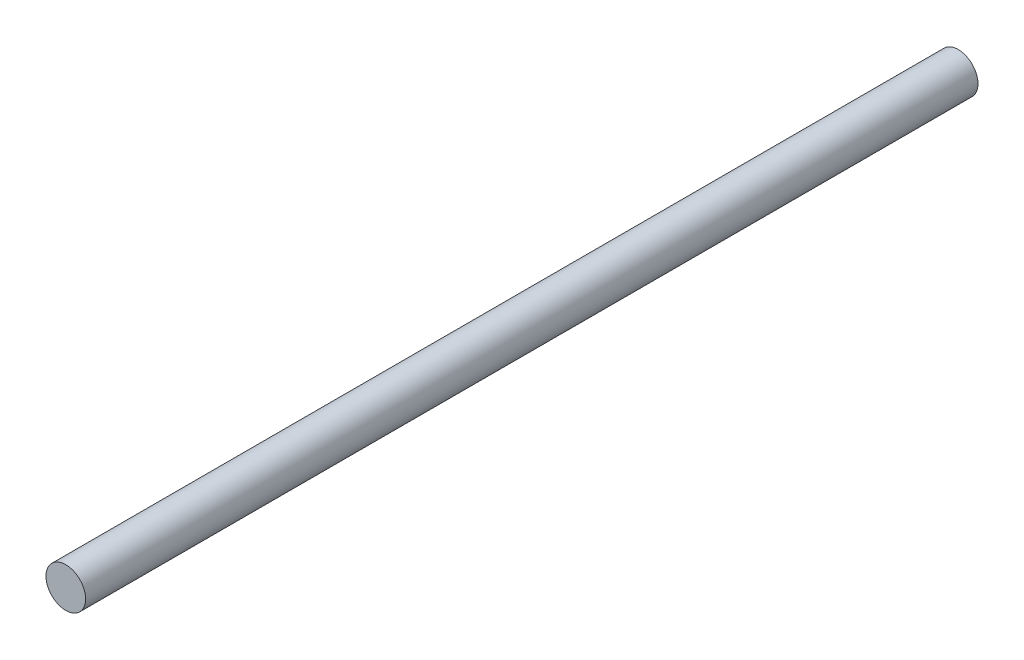
ISO-10303-21;
HEADER;
FILE_DESCRIPTION(('STEP AP214'),'2;1');
FILE_NAME('part.step','',(''),(''),'','','');
FILE_SCHEMA(('AUTOMOTIVE_DESIGN { 1 0 10303 214 1 1 1 1 }'));
ENDSEC;
DATA;
#1=APPLICATION_CONTEXT('core data for automotive mechanical design processes');
#2=APPLICATION_PROTOCOL_DEFINITION('international standard','automotive_design',2000,#1);
#3=PRODUCT_CONTEXT('',#1,'mechanical');
#4=PRODUCT('Part','Part','',(#3));
#5=PRODUCT_RELATED_PRODUCT_CATEGORY('part','',(#4));
#6=PRODUCT_DEFINITION_FORMATION('','',#4);
#7=PRODUCT_DEFINITION_CONTEXT('part definition',#1,'design');
#8=PRODUCT_DEFINITION('design','',#6,#7);
#9=PRODUCT_DEFINITION_SHAPE('','',#8);
#10=(LENGTH_UNIT() NAMED_UNIT(*) SI_UNIT(.MILLI.,.METRE.));
#11=(NAMED_UNIT(*) PLANE_ANGLE_UNIT() SI_UNIT($,.RADIAN.));
#12=(NAMED_UNIT(*) SI_UNIT($,.STERADIAN.) SOLID_ANGLE_UNIT());
#13=UNCERTAINTY_MEASURE_WITH_UNIT(LENGTH_MEASURE(1.E-05),#10,'distance_accuracy_value','');
#14=(GEOMETRIC_REPRESENTATION_CONTEXT(3) GLOBAL_UNCERTAINTY_ASSIGNED_CONTEXT((#13)) GLOBAL_UNIT_ASSIGNED_CONTEXT((#10,
#11,#12)) REPRESENTATION_CONTEXT('',''));
#15=CARTESIAN_POINT('',(0.,0.,0.));
#16=DIRECTION('',(0.,0.,1.));
#17=DIRECTION('',(1.,0.,0.));
#18=AXIS2_PLACEMENT_3D('',#15,#16,#17);
#19=CARTESIAN_POINT('',(0.,0.,225.));
#20=DIRECTION('',(0.,0.,-1.));
#21=DIRECTION('',(-1.,0.,0.));
#22=AXIS2_PLACEMENT_3D('',#19,#20,#21);
#23=CYLINDRICAL_SURFACE('',#22,10.);
#24=CARTESIAN_POINT('',(0.,0.,225.));
#25=DIRECTION('',(0.,0.,1.));
#26=DIRECTION('',(1.,0.,0.));
#27=AXIS2_PLACEMENT_3D('',#24,#25,#26);
#28=CIRCLE('',#27,10.);
#29=CARTESIAN_POINT('',(10.,0.,225.));
#30=VERTEX_POINT('',#29);
#31=EDGE_CURVE('E10',#30,#30,#28,.T.);
#32=ORIENTED_EDGE('',*,*,#31,.F.);
#33=EDGE_LOOP('',(#32));
#34=FACE_BOUND('',#33,.T.);
#35=CARTESIAN_POINT('',(0.,0.,-225.));
#36=DIRECTION('',(0.,0.,1.));
#37=DIRECTION('',(1.,0.,0.));
#38=AXIS2_PLACEMENT_3D('',#35,#36,#37);
#39=CIRCLE('',#38,10.);
#40=CARTESIAN_POINT('',(10.,0.,-225.));
#41=VERTEX_POINT('',#40);
#42=EDGE_CURVE('E34',#41,#41,#39,.T.);
#43=ORIENTED_EDGE('',*,*,#42,.T.);
#44=EDGE_LOOP('',(#43));
#45=FACE_BOUND('',#44,.T.);
#46=ADVANCED_FACE('F31',(#34,#45),#23,.T.);
#47=CARTESIAN_POINT('',(0.,0.,225.));
#48=DIRECTION('',(0.,0.,1.));
#49=DIRECTION('',(1.,0.,0.));
#50=AXIS2_PLACEMENT_3D('',#47,#48,#49);
#51=PLANE('',#50);
#52=ORIENTED_EDGE('',*,*,#31,.T.);
#53=EDGE_LOOP('',(#52));
#54=FACE_BOUND('',#53,.T.);
#55=ADVANCED_FACE('F46',(#54),#51,.T.);
#56=CARTESIAN_POINT('',(0.,0.,-225.));
#57=DIRECTION('',(0.,0.,1.));
#58=DIRECTION('',(1.,0.,0.));
#59=AXIS2_PLACEMENT_3D('',#56,#57,#58);
#60=PLANE('',#59);
#61=ORIENTED_EDGE('',*,*,#42,.F.);
#62=EDGE_LOOP('',(#61));
#63=FACE_BOUND('',#62,.T.);
#64=ADVANCED_FACE('F44',(#63),#60,.F.);
#65=CLOSED_SHELL('',(#46,#55,#64));
#66=MANIFOLD_SOLID_BREP('B2',#65);
#67=ADVANCED_BREP_SHAPE_REPRESENTATION('',(#18,#66),#14);
#68=SHAPE_DEFINITION_REPRESENTATION(#9,#67);
ENDSEC;
END-ISO-10303-21;
